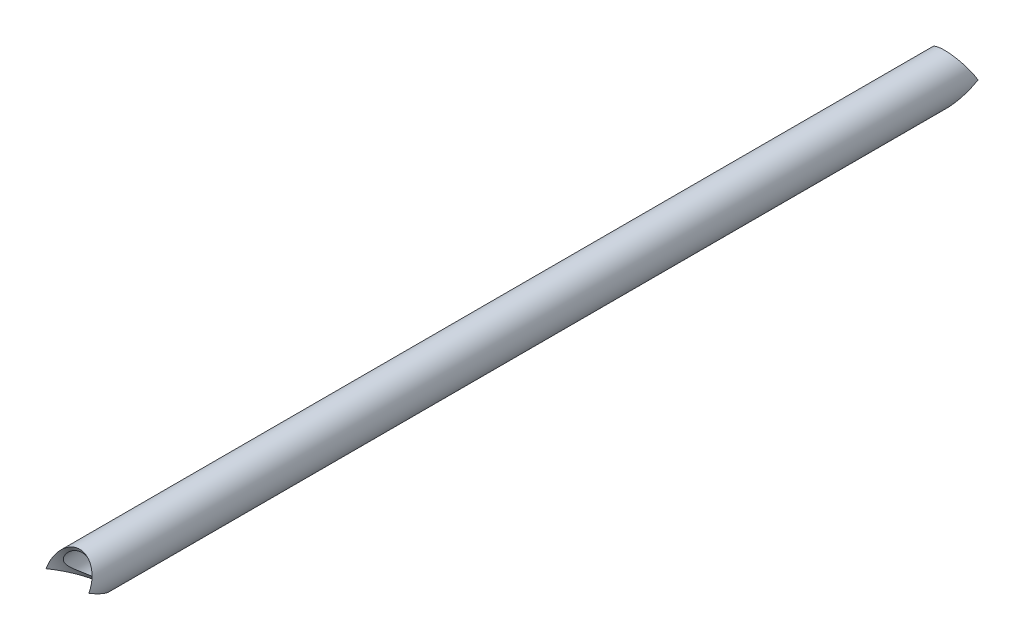
ISO-10303-21;
HEADER;
FILE_DESCRIPTION(('STEP AP214'),'2;1');
FILE_NAME('part.step','',(''),(''),'','','');
FILE_SCHEMA(('AUTOMOTIVE_DESIGN { 1 0 10303 214 1 1 1 1 }'));
ENDSEC;
DATA;
#1=APPLICATION_CONTEXT('core data for automotive mechanical design processes');
#2=APPLICATION_PROTOCOL_DEFINITION('international standard','automotive_design',2000,#1);
#3=PRODUCT_CONTEXT('',#1,'mechanical');
#4=PRODUCT('Part','Part','',(#3));
#5=PRODUCT_RELATED_PRODUCT_CATEGORY('part','',(#4));
#6=PRODUCT_DEFINITION_FORMATION('','',#4);
#7=PRODUCT_DEFINITION_CONTEXT('part definition',#1,'design');
#8=PRODUCT_DEFINITION('design','',#6,#7);
#9=PRODUCT_DEFINITION_SHAPE('','',#8);
#10=(LENGTH_UNIT() NAMED_UNIT(*) SI_UNIT(.MILLI.,.METRE.));
#11=(NAMED_UNIT(*) PLANE_ANGLE_UNIT() SI_UNIT($,.RADIAN.));
#12=(NAMED_UNIT(*) SI_UNIT($,.STERADIAN.) SOLID_ANGLE_UNIT());
#13=UNCERTAINTY_MEASURE_WITH_UNIT(LENGTH_MEASURE(1.E-05),#10,'distance_accuracy_value','');
#14=(GEOMETRIC_REPRESENTATION_CONTEXT(3) GLOBAL_UNCERTAINTY_ASSIGNED_CONTEXT((#13)) GLOBAL_UNIT_ASSIGNED_CONTEXT((#10,
#11,#12)) REPRESENTATION_CONTEXT('',''));
#15=CARTESIAN_POINT('',(0.,0.,0.));
#16=DIRECTION('',(0.,0.,1.));
#17=DIRECTION('',(1.,0.,0.));
#18=AXIS2_PLACEMENT_3D('',#15,#16,#17);
#19=CARTESIAN_POINT('',(2.62810606610486E-13,-6.0750000001009,-234.657183252118));
#20=DIRECTION('',(0.,0.,1.));
#21=DIRECTION('',(1.,0.,0.));
#22=AXIS2_PLACEMENT_3D('',#19,#20,#21);
#23=CYLINDRICAL_SURFACE('',#22,10.65);
#24=CARTESIAN_POINT('',(1.22685876863047E-13,-6.0750000001009,-221.492597114571));
#25=DIRECTION('',(0.,0.866025403784403,0.500000000000061));
#26=DIRECTION('',(0.,-0.500000000000061,0.866025403784403));
#27=AXIS2_PLACEMENT_3D('',#24,#25,#26);
#28=ELLIPSE('',#27,21.2999999999974,10.65);
#29=CARTESIAN_POINT('',(-10.6499999999999,-6.07500000010092,-221.492597114571));
#30=VERTEX_POINT('',#29);
#31=CARTESIAN_POINT('',(10.6500000000001,-6.07500000010088,-221.492597114571));
#32=VERTEX_POINT('',#31);
#33=EDGE_CURVE('E39',#30,#32,#28,.T.);
#34=ORIENTED_EDGE('',*,*,#33,.T.);
#35=CARTESIAN_POINT('',(1.22685876863047E-13,-6.0750000001009,-221.492597114571));
#36=DIRECTION('',(0.,-0.500000000000061,0.866025403784403));
#37=DIRECTION('',(0.,0.866025403784403,0.500000000000061));
#38=AXIS2_PLACEMENT_3D('',#35,#36,#37);
#39=ELLIPSE('',#38,12.2975607337395,10.65);
#40=EDGE_CURVE('E45',#32,#30,#39,.T.);
#41=ORIENTED_EDGE('',*,*,#40,.T.);
#42=EDGE_LOOP('',(#34,#41));
#43=FACE_BOUND('',#42,.T.);
#44=CARTESIAN_POINT('',(1.22685876863047E-13,-6.0750000001009,221.492597114571));
#45=DIRECTION('',(0.,-0.866025403784403,0.500000000000061));
#46=DIRECTION('',(0.,-0.500000000000061,-0.866025403784403));
#47=AXIS2_PLACEMENT_3D('',#44,#45,#46);
#48=ELLIPSE('',#47,21.2999999999974,10.65);
#49=CARTESIAN_POINT('',(-10.6499999999999,-6.07500000010092,221.492597114571));
#50=VERTEX_POINT('',#49);
#51=CARTESIAN_POINT('',(10.6500000000001,-6.07500000010088,221.492597114571));
#52=VERTEX_POINT('',#51);
#53=EDGE_CURVE('E64',#50,#52,#48,.T.);
#54=ORIENTED_EDGE('',*,*,#53,.F.);
#55=CARTESIAN_POINT('',(1.22685876863047E-13,-6.0750000001009,221.492597114571));
#56=DIRECTION('',(0.,0.500000000000061,0.866025403784403));
#57=DIRECTION('',(0.,0.866025403784403,-0.500000000000061));
#58=AXIS2_PLACEMENT_3D('',#55,#56,#57);
#59=ELLIPSE('',#58,12.2975607337395,10.65);
#60=EDGE_CURVE('E60',#52,#50,#59,.T.);
#61=ORIENTED_EDGE('',*,*,#60,.F.);
#62=EDGE_LOOP('',(#54,#61));
#63=FACE_BOUND('',#62,.T.);
#64=ADVANCED_FACE('F34',(#43,#63),#23,.T.);
#65=CARTESIAN_POINT('',(2.62810606610486E-13,-6.0750000001009,-234.657183252118));
#66=DIRECTION('',(0.,0.,1.));
#67=DIRECTION('',(1.,0.,0.));
#68=AXIS2_PLACEMENT_3D('',#65,#66,#67);
#69=CYLINDRICAL_SURFACE('',#68,8.65);
#70=CARTESIAN_POINT('',(8.65000000000026,-6.0750000001009,-214.31856988667));
#71=CARTESIAN_POINT('',(8.64999937803353,-5.92818391814189,-214.403334178954));
#72=CARTESIAN_POINT('',(8.64626274910733,-5.77875572488741,-214.483586237544));
#73=CARTESIAN_POINT('',(8.63051404007033,-5.47515065155016,-214.633652050164));
#74=CARTESIAN_POINT('',(8.61850310980531,-5.3209744341244,-214.703467252921));
#75=CARTESIAN_POINT('',(8.58549136002935,-5.00897766827809,-214.831379325089));
#76=CARTESIAN_POINT('',(8.56450206368782,-4.85116203560619,-214.889491075017));
#77=CARTESIAN_POINT('',(8.51297710355449,-4.53302790295168,-214.993351374035));
#78=CARTESIAN_POINT('',(8.48244146927621,-4.37270941070839,-215.039099961345));
#79=CARTESIAN_POINT('',(8.41148621827944,-4.05100459517885,-215.118138188344));
#80=CARTESIAN_POINT('',(8.37105601253816,-3.88961730931378,-215.151414383037));
#81=CARTESIAN_POINT('',(8.2803069748772,-3.56761051846948,-215.205960390574));
#82=CARTESIAN_POINT('',(8.22998781020915,-3.40699103951212,-215.227229799315));
#83=CARTESIAN_POINT('',(8.11955918288864,-3.08771822973509,-215.258856011481));
#84=CARTESIAN_POINT('',(8.05943008935736,-2.9290695422446,-215.269190616049));
#85=CARTESIAN_POINT('',(7.92980127101989,-2.61529040452393,-215.28028017569));
#86=CARTESIAN_POINT('',(7.86029883349685,-2.4601609880373,-215.281032351496));
#87=CARTESIAN_POINT('',(7.69251740767339,-2.1134301510355,-215.273613080845));
#88=CARTESIAN_POINT('',(7.59151815094356,-1.92319572058121,-215.262996184864));
#89=CARTESIAN_POINT('',(7.37601667855903,-1.55138491515996,-215.231890874316));
#90=CARTESIAN_POINT('',(7.26151062378756,-1.3698110225237,-215.211399647979));
#91=CARTESIAN_POINT('',(7.01974442801463,-1.01618599872964,-215.163277190634));
#92=CARTESIAN_POINT('',(6.8924746440974,-0.844142222170902,-215.135640536044));
#93=CARTESIAN_POINT('',(6.62602035216129,-0.51047482809886,-215.07559516932));
#94=CARTESIAN_POINT('',(6.48683667995924,-0.348850481004587,-215.043186791829));
#95=CARTESIAN_POINT('',(6.19369921715739,-0.0328005911682971,-214.974752058142));
#96=CARTESIAN_POINT('',(6.03946719637247,0.12135174210956,-214.93865653827));
#97=CARTESIAN_POINT('',(5.71996280967953,0.417454581883274,-214.865325286771));
#98=CARTESIAN_POINT('',(5.55469039583154,0.559405035389594,-214.828089550193));
#99=CARTESIAN_POINT('',(5.21389860047934,0.830443229247959,-214.753988132868));
#100=CARTESIAN_POINT('',(5.03838164399966,0.959533994239528,-214.717122366944));
#101=CARTESIAN_POINT('',(4.67787691764155,1.20424676270569,-214.64502303159));
#102=CARTESIAN_POINT('',(4.49288897525192,1.31986852072057,-214.609789491911));
#103=CARTESIAN_POINT('',(4.08963935720766,1.5511505009423,-214.537620721229));
#104=CARTESIAN_POINT('',(3.87018262639265,1.66485316123166,-214.501061843012));
#105=CARTESIAN_POINT('',(3.42170434916144,1.87330748079689,-214.432725766793));
#106=CARTESIAN_POINT('',(3.19268197861163,1.96805750310843,-214.400948981884));
#107=CARTESIAN_POINT('',(2.72667233822101,2.13774898214253,-214.343247801543));
#108=CARTESIAN_POINT('',(2.48968464132746,2.21268937487671,-214.317323720474));
#109=CARTESIAN_POINT('',(2.00954587057573,2.34200831155892,-214.272173457625));
#110=CARTESIAN_POINT('',(1.76639521489029,2.39638824662322,-214.252946822704));
#111=CARTESIAN_POINT('',(1.28688815577995,2.48204637620698,-214.222498941825));
#112=CARTESIAN_POINT('',(1.05071773862573,2.51425324174458,-214.210956658852));
#113=CARTESIAN_POINT('',(0.576287751522237,2.55906969920783,-214.194863836511));
#114=CARTESIAN_POINT('',(0.338028232849151,2.57167977078267,-214.190313126017));
#115=CARTESIAN_POINT('',(-0.138694398065788,2.57717181009427,-214.188333291338));
#116=CARTESIAN_POINT('',(-0.377157454410202,2.5700580902037,-214.190902610443));
#117=CARTESIAN_POINT('',(-0.852499060908479,2.53618555803724,-214.203086504878));
#118=CARTESIAN_POINT('',(-1.08937763949964,2.50942709929363,-214.212700953422));
#119=CARTESIAN_POINT('',(-1.55084699910016,2.43792048400041,-214.238206932494));
#120=CARTESIAN_POINT('',(-1.77556361879941,2.39389120626498,-214.253847229692));
#121=CARTESIAN_POINT('',(-2.22033596035138,2.28830373517407,-214.29097599264));
#122=CARTESIAN_POINT('',(-2.44039182888922,2.22674609436203,-214.312464274044));
#123=CARTESIAN_POINT('',(-2.87439182216442,2.08663978894635,-214.360703455727));
#124=CARTESIAN_POINT('',(-3.08833678882559,2.00809347784844,-214.38745362701));
#125=CARTESIAN_POINT('',(-3.50884695015058,1.83462882662579,-214.445473252315));
#126=CARTESIAN_POINT('',(-3.71541192514914,1.73970999966283,-214.476742840717));
#127=CARTESIAN_POINT('',(-4.12561504865931,1.53132550270658,-214.543811828955));
#128=CARTESIAN_POINT('',(-4.32901148650136,1.41741694075003,-214.579713127185));
#129=CARTESIAN_POINT('',(-4.72560996425205,1.17381198963311,-214.654143512758));
#130=CARTESIAN_POINT('',(-4.91881176220194,1.04411522599822,-214.69267266242));
#131=CARTESIAN_POINT('',(-5.29426000335263,0.769522023130603,-214.771006624231));
#132=CARTESIAN_POINT('',(-5.47649012979106,0.62460378450132,-214.810813207639));
#133=CARTESIAN_POINT('',(-5.82873985001123,0.320501220755215,-214.889963151437));
#134=CARTESIAN_POINT('',(-5.99875927649479,0.161316700243936,-214.929306505474));
#135=CARTESIAN_POINT('',(-6.33518765877032,-0.180202328669105,-215.007728087674));
#136=CARTESIAN_POINT('',(-6.50081325634424,-0.363344440878967,-215.046658172388));
#137=CARTESIAN_POINT('',(-6.81634213928543,-0.743858261151386,-215.118842657242));
#138=CARTESIAN_POINT('',(-6.96624167784306,-0.941233341472005,-215.152095705978));
#139=CARTESIAN_POINT('',(-7.24880778217018,-1.34862623761404,-215.209289924044));
#140=CARTESIAN_POINT('',(-7.38151120832252,-1.55861555028828,-215.23325123794));
#141=CARTESIAN_POINT('',(-7.62872444595299,-1.99005747432089,-215.267694096271));
#142=CARTESIAN_POINT('',(-7.74324661530751,-2.21150216250115,-215.278184831389));
#143=CARTESIAN_POINT('',(-7.91587661528786,-2.58394120092184,-215.280441159871));
#144=CARTESIAN_POINT('',(-7.97965328460128,-2.73229882181032,-215.277497809446));
#145=CARTESIAN_POINT('',(-8.09865941914403,-3.03194667188313,-215.262646050997));
#146=CARTESIAN_POINT('',(-8.15389168150594,-3.18323592302901,-215.250740584367));
#147=CARTESIAN_POINT('',(-8.2554380969152,-3.48735751122945,-215.216838493549));
#148=CARTESIAN_POINT('',(-8.30176915263766,-3.64018633186807,-215.194861269075));
#149=CARTESIAN_POINT('',(-8.38549388456894,-3.94634433815316,-215.139973232866));
#150=CARTESIAN_POINT('',(-8.42288752849253,-4.09967352560512,-215.107062381635));
#151=CARTESIAN_POINT('',(-8.48887463244796,-4.40583737007928,-215.029807214933));
#152=CARTESIAN_POINT('',(-8.51744234753745,-4.55866931727322,-214.985430131507));
#153=CARTESIAN_POINT('',(-8.56590540255666,-4.86200299054528,-214.885444391442));
#154=CARTESIAN_POINT('',(-8.58580081854713,-5.01250473704935,-214.829835833315));
#155=CARTESIAN_POINT('',(-8.61742448664831,-5.31019147266027,-214.707983310788));
#156=CARTESIAN_POINT('',(-8.62914387610751,-5.45737269573571,-214.641727900794));
#157=CARTESIAN_POINT('',(-8.64501885033591,-5.74748069437717,-214.49964607783));
#158=CARTESIAN_POINT('',(-8.64917188259975,-5.89040601823013,-214.423816444224));
#159=CARTESIAN_POINT('',(-8.65091176420859,-6.23194986388134,-214.229417078581));
#160=CARTESIAN_POINT('',(-8.64490991978785,-6.42810720231548,-214.106484110163));
#161=CARTESIAN_POINT('',(-8.62080404537304,-6.81052557395368,-213.847173136496));
#162=CARTESIAN_POINT('',(-8.60269349220117,-6.99678121452092,-213.710787918058));
#163=CARTESIAN_POINT('',(-8.55591593176121,-7.36050738609285,-213.427353553806));
#164=CARTESIAN_POINT('',(-8.52721453919786,-7.537947141297,-213.280270939749));
#165=CARTESIAN_POINT('',(-8.46048539057305,-7.88436872195521,-212.978398129048));
#166=CARTESIAN_POINT('',(-8.42245385331511,-8.05334708477396,-212.82360482784));
#167=CARTESIAN_POINT('',(-8.33930780952916,-8.37840220814502,-212.513515071326));
#168=CARTESIAN_POINT('',(-8.29446233610328,-8.53471951610767,-212.358396995954));
#169=CARTESIAN_POINT('',(-8.19738755510028,-8.84107106251888,-212.044387173413));
#170=CARTESIAN_POINT('',(-8.14515935111408,-8.99110623570116,-211.885495993206));
#171=CARTESIAN_POINT('',(-8.03358147622612,-9.28574819858371,-211.564926333264));
#172=CARTESIAN_POINT('',(-7.97422521882721,-9.4303498030485,-211.403245395676));
#173=CARTESIAN_POINT('',(-7.84858289044796,-9.71455859815115,-211.078170374462));
#174=CARTESIAN_POINT('',(-7.78229605383321,-9.85416523469392,-210.914776103357));
#175=CARTESIAN_POINT('',(-7.64278789689178,-10.1288919668576,-210.586994767443));
#176=CARTESIAN_POINT('',(-7.5695623719188,-10.2640092742325,-210.422607157912));
#177=CARTESIAN_POINT('',(-7.41613086611562,-10.5300058911494,-210.093633218607));
#178=CARTESIAN_POINT('',(-7.33592422353112,-10.6608847973078,-209.929046871455));
#179=CARTESIAN_POINT('',(-7.16842967186115,-10.9185222938855,-209.600461195008));
#180=CARTESIAN_POINT('',(-7.08114669097958,-11.0452836671715,-209.436461538831));
#181=CARTESIAN_POINT('',(-6.89920629382361,-11.294894467887,-209.109578678765));
#182=CARTESIAN_POINT('',(-6.80454875726971,-11.4177438314654,-208.946695493132));
#183=CARTESIAN_POINT('',(-6.56519981119249,-11.7115247676413,-208.553064258996));
#184=CARTESIAN_POINT('',(-6.41648661666513,-11.8804340933449,-208.323229781856));
#185=CARTESIAN_POINT('',(-6.1021040141915,-12.2100386201845,-207.869221850383));
#186=CARTESIAN_POINT('',(-5.93643204735865,-12.3707325762129,-207.645049256745));
#187=CARTESIAN_POINT('',(-5.58706670598686,-12.6827156752362,-207.205430472806));
#188=CARTESIAN_POINT('',(-5.40341885193532,-12.8340270663073,-206.989964097213));
#189=CARTESIAN_POINT('',(-5.01605964050975,-13.1262758980244,-206.570368858222));
#190=CARTESIAN_POINT('',(-4.81235869354405,-13.2672186557522,-206.366234197238));
#191=CARTESIAN_POINT('',(-4.46395431537802,-13.4858360011132,-206.047478363284));
#192=CARTESIAN_POINT('',(-4.32596965085822,-13.5673265354651,-205.928130201261));
#193=CARTESIAN_POINT('',(-4.04104693269482,-13.7247682173392,-205.69669519149));
#194=CARTESIAN_POINT('',(-3.89410768994059,-13.8007186262133,-205.584609312224));
#195=CARTESIAN_POINT('',(-3.43953622820813,-14.018863431312,-205.261648690583));
#196=CARTESIAN_POINT('',(-3.11767000653595,-14.1516605291854,-205.063618487489));
#197=CARTESIAN_POINT('',(-2.51329904826401,-14.3564868218933,-204.756915503415));
#198=CARTESIAN_POINT('',(-2.23837288737308,-14.4354670465624,-204.638162606368));
#199=CARTESIAN_POINT('',(-1.81149183588547,-14.5344559441326,-204.489011136104));
#200=CARTESIAN_POINT('',(-1.66677696284453,-14.5642061119258,-204.44412244753));
#201=CARTESIAN_POINT('',(-1.37323763265812,-14.6165986634819,-204.365001384351));
#202=CARTESIAN_POINT('',(-1.22441515227414,-14.6392444034896,-204.330763977974));
#203=CARTESIAN_POINT('',(-0.922228530534799,-14.6770575527531,-204.273563421091));
#204=CARTESIAN_POINT('',(-0.768835207762689,-14.6921542688322,-204.250706855103));
#205=CARTESIAN_POINT('',(-0.460111209939084,-14.7141399657246,-204.21741182182));
#206=CARTESIAN_POINT('',(-0.304780550296689,-14.7210290117776,-204.206973255819));
#207=CARTESIAN_POINT('',(0.00631804623118596,-14.7263962344597,-204.198841069384));
#208=CARTESIAN_POINT('',(0.162085851106803,-14.7248767237457,-204.201143944593));
#209=CARTESIAN_POINT('',(0.472597570432842,-14.713477071849,-204.218414303227));
#210=CARTESIAN_POINT('',(0.627341552834372,-14.7035974912497,-204.233380937485));
#211=CARTESIAN_POINT('',(0.914629127249093,-14.6775579324822,-204.272802058024));
#212=CARTESIAN_POINT('',(1.04746675019267,-14.6623698977834,-204.295787533905));
#213=CARTESIAN_POINT('',(1.31053948151359,-14.6261774919321,-204.350517530461));
#214=CARTESIAN_POINT('',(1.44077378597053,-14.605171352979,-204.382264713325));
#215=CARTESIAN_POINT('',(1.82650942834324,-14.5339970079904,-204.489725935052));
#216=CARTESIAN_POINT('',(2.07716005820117,-14.4756618015444,-204.577676472903));
#217=CARTESIAN_POINT('',(2.67701044964133,-14.3087067370691,-204.828621913453));
#218=CARTESIAN_POINT('',(3.0165714377184,-14.1893597727858,-205.007425315256));
#219=CARTESIAN_POINT('',(3.49694388024323,-13.9885470087134,-205.306335038703));
#220=CARTESIAN_POINT('',(3.65245291749707,-13.9178539233222,-205.411271039483));
#221=CARTESIAN_POINT('',(3.95415605806211,-13.7701478761526,-205.629750323816));
#222=CARTESIAN_POINT('',(4.10035178316889,-13.6931360200818,-205.7432921012));
#223=CARTESIAN_POINT('',(4.47217067277728,-13.4839136252541,-206.050518748322));
#224=CARTESIAN_POINT('',(4.69046621582095,-13.3472318744137,-206.2500232324));
#225=CARTESIAN_POINT('',(5.10542040241989,-13.0621722295382,-206.662762551199));
#226=CARTESIAN_POINT('',(5.30206445824718,-12.9137865641119,-206.876006491407));
#227=CARTESIAN_POINT('',(5.6761968927374,-12.6066202489088,-207.313164661516));
#228=CARTESIAN_POINT('',(5.8536163377944,-12.4478052715922,-207.537113392498));
#229=CARTESIAN_POINT('',(6.19021131259998,-12.1213821227297,-207.992028289499));
#230=CARTESIAN_POINT('',(6.34939068740933,-11.9537758153222,-208.2229929635));
#231=CARTESIAN_POINT('',(6.61712450602722,-11.6488278055271,-208.637261515534));
#232=CARTESIAN_POINT('',(6.72902472853557,-11.5131322709547,-208.819633069891));
#233=CARTESIAN_POINT('',(6.94326792392722,-11.2367929000729,-209.186267210885));
#234=CARTESIAN_POINT('',(7.04560988610095,-11.0961485426251,-209.370529995222));
#235=CARTESIAN_POINT('',(7.24122557898484,-10.809687271262,-209.740187930338));
#236=CARTESIAN_POINT('',(7.33449006193058,-10.6638652847315,-209.925584035565));
#237=CARTESIAN_POINT('',(7.51210861764674,-10.366929029481,-210.296389482724));
#238=CARTESIAN_POINT('',(7.59646314201677,-10.2158150295032,-210.481798823508));
#239=CARTESIAN_POINT('',(7.75620337110392,-9.90824485952115,-210.851182525652));
#240=CARTESIAN_POINT('',(7.83161100983176,-9.75180301735941,-211.035159317978));
#241=CARTESIAN_POINT('',(7.97368173187773,-9.43259257532649,-211.401043609676));
#242=CARTESIAN_POINT('',(8.04034383363427,-9.26982326794085,-211.582950874684));
#243=CARTESIAN_POINT('',(8.16459670931731,-8.93739573476339,-211.943072125657));
#244=CARTESIAN_POINT('',(8.22219981237286,-8.76774727418428,-212.121290839527));
#245=CARTESIAN_POINT('',(8.32794134031502,-8.42039006356103,-212.472548478145));
#246=CARTESIAN_POINT('',(8.37608284212251,-8.2426839570839,-212.645589071252));
#247=CARTESIAN_POINT('',(8.4547282351649,-7.90916947852937,-212.955362493601));
#248=CARTESIAN_POINT('',(8.48684042867025,-7.75481212066091,-213.093244527845));
#249=CARTESIAN_POINT('',(8.54328935211217,-7.43898150883778,-213.362357764532));
#250=CARTESIAN_POINT('',(8.56762596647533,-7.277508149154,-213.493588868094));
#251=CARTESIAN_POINT('',(8.60751619567153,-6.94721879375606,-213.747078112623));
#252=CARTESIAN_POINT('',(8.62309164938072,-6.77842219534786,-213.86935789795));
#253=CARTESIAN_POINT('',(8.64433263886607,-6.4327368227116,-214.102895405708));
#254=CARTESIAN_POINT('',(8.6500007661479,-6.25585017706147,-214.214156003294));
#255=CARTESIAN_POINT('',(8.65000000000026,-6.0750000001009,-214.31856988667));
#256=B_SPLINE_CURVE_WITH_KNOTS('',3,(#70,#71,#72,#73,#74,#75,#76,#77,#78,#79,#80,#81,#82,#83,
#84,#85,#86,#87,#88,#89,#90,#91,#92,#93,#94,#95,#96,#97,#98,#99,#100,#101,#102,#103,#104,#105,
#106,#107,#108,#109,#110,#111,#112,#113,#114,#115,#116,#117,#118,#119,#120,#121,#122,#123,#124,
#125,#126,#127,#128,#129,#130,#131,#132,#133,#134,#135,#136,#137,#138,#139,#140,#141,#142,#143,
#144,#145,#146,#147,#148,#149,#150,#151,#152,#153,#154,#155,#156,#157,#158,#159,#160,#161,#162,
#163,#164,#165,#166,#167,#168,#169,#170,#171,#172,#173,#174,#175,#176,#177,#178,#179,#180,#181,
#182,#183,#184,#185,#186,#187,#188,#189,#190,#191,#192,#193,#194,#195,#196,#197,#198,#199,#200,
#201,#202,#203,#204,#205,#206,#207,#208,#209,#210,#211,#212,#213,#214,#215,#216,#217,#218,#219,
#220,#221,#222,#223,#224,#225,#226,#227,#228,#229,#230,#231,#232,#233,#234,#235,#236,#237,#238,
#239,#240,#241,#242,#243,#244,#245,#246,#247,#248,#249,#250,#251,#252,#253,#254,#255),
.UNSPECIFIED.,.T.,.F.,(4,2,2,2,2,2,2,2,2,2,2,2,2,2,2,2,2,2,2,2,2,2,2,2,2,2,2,2,2,2,2,2,2,2,2,2,
2,2,2,2,2,2,2,2,2,2,2,2,2,2,2,2,2,2,2,2,2,2,2,2,2,2,2,2,2,2,2,2,2,2,2,2,2,2,2,2,2,2,2,2,2,2,2,2,
2,2,2,2,2,2,2,2,4),(0.,0.50844506770032,1.01681949312021,1.52454340032979,2.03226573787238,
2.54053382673734,3.04881902097642,3.55813412185321,4.06759693996536,4.71359002947254,
5.35976717786682,6.00643624012418,6.6530599725448,7.31551844685078,7.9779797978934,
8.6402849662055,9.30260220250564,10.0512091879152,10.7998808036044,11.5485926227777,
12.2972537751969,13.0122575701417,13.7272438644488,14.4420738478247,15.1568909672331,
15.8446653307737,16.5324180161265,17.2200754854148,17.9077534057857,18.6145823037831,
19.3214279700606,20.0293001149051,20.7371819564203,21.4861817527539,22.2353595985674,
22.982904015949,23.7299381285009,24.2140392664683,24.6979815901783,25.180995661056,
25.6640114767329,26.1484232132305,26.6328307010897,27.117762464654,27.6028577893435,
28.2964167818695,28.9903497083936,29.686555740942,30.3830443900298,31.0569944659831,
31.7308439043488,32.4053208577864,33.0798724008734,33.7548353491971,34.4298623484516,
35.1044232089343,35.7789950738536,36.7434305731184,37.708011809881,38.6702106916392,
39.6319126633935,40.2309613246267,40.8300897097657,42.0261773485565,42.9515592316291,
43.4142860297685,43.8767938980604,44.3435554209343,44.8103132336663,45.2769426775158,
45.7435408340745,46.1500870679645,46.5567569645805,47.3697458590115,48.5683011522664,
49.1693990091058,49.7703919045981,50.7462014804333,51.7226645377541,52.7025204724633,
53.6821694691644,54.4420360299657,55.2019828498199,55.9626959419759,56.7233704590089,
57.4821398028627,58.2409942350116,58.9988067717562,59.7563724579484,60.3844095628076,
61.0124560021506,61.6389298975941,62.2652398987969),.UNSPECIFIED.);
#257=CARTESIAN_POINT('',(8.65000000000026,-6.0750000001009,-214.31856988667));
#258=VERTEX_POINT('',#257);
#259=EDGE_CURVE('E11',#258,#258,#256,.T.);
#260=ORIENTED_EDGE('',*,*,#259,.F.);
#261=EDGE_LOOP('',(#260));
#262=FACE_BOUND('',#261,.T.);
#263=CARTESIAN_POINT('',(8.65000000000026,-6.0750000001009,214.31856988667));
#264=CARTESIAN_POINT('',(8.64999937803353,-5.92818391814189,214.403334178954));
#265=CARTESIAN_POINT('',(8.64626274910733,-5.77875572488741,214.483586237544));
#266=CARTESIAN_POINT('',(8.63051404007033,-5.47515065155016,214.633652050164));
#267=CARTESIAN_POINT('',(8.61850310980531,-5.3209744341244,214.703467252921));
#268=CARTESIAN_POINT('',(8.58549136002935,-5.00897766827809,214.831379325089));
#269=CARTESIAN_POINT('',(8.56450206368782,-4.85116203560619,214.889491075017));
#270=CARTESIAN_POINT('',(8.51297710355449,-4.53302790295168,214.993351374035));
#271=CARTESIAN_POINT('',(8.48244146927621,-4.37270941070839,215.039099961345));
#272=CARTESIAN_POINT('',(8.41148621827944,-4.05100459517885,215.118138188344));
#273=CARTESIAN_POINT('',(8.37105601253816,-3.88961730931378,215.151414383037));
#274=CARTESIAN_POINT('',(8.2803069748772,-3.56761051846948,215.205960390574));
#275=CARTESIAN_POINT('',(8.22998781020915,-3.40699103951212,215.227229799315));
#276=CARTESIAN_POINT('',(8.11955918288864,-3.08771822973509,215.258856011481));
#277=CARTESIAN_POINT('',(8.05943008935736,-2.9290695422446,215.269190616049));
#278=CARTESIAN_POINT('',(7.92980127101989,-2.61529040452393,215.28028017569));
#279=CARTESIAN_POINT('',(7.86029883349685,-2.4601609880373,215.281032351496));
#280=CARTESIAN_POINT('',(7.69251740767339,-2.1134301510355,215.273613080845));
#281=CARTESIAN_POINT('',(7.59151815094356,-1.92319572058121,215.262996184864));
#282=CARTESIAN_POINT('',(7.37601667855903,-1.55138491515996,215.231890874316));
#283=CARTESIAN_POINT('',(7.26151062378756,-1.3698110225237,215.211399647979));
#284=CARTESIAN_POINT('',(7.01974442801463,-1.01618599872964,215.163277190634));
#285=CARTESIAN_POINT('',(6.8924746440974,-0.844142222170902,215.135640536044));
#286=CARTESIAN_POINT('',(6.62602035216129,-0.51047482809886,215.07559516932));
#287=CARTESIAN_POINT('',(6.48683667995924,-0.348850481004587,215.043186791829));
#288=CARTESIAN_POINT('',(6.19369921715739,-0.0328005911682971,214.974752058142));
#289=CARTESIAN_POINT('',(6.03946719637247,0.12135174210956,214.93865653827));
#290=CARTESIAN_POINT('',(5.71996280967953,0.417454581883274,214.865325286771));
#291=CARTESIAN_POINT('',(5.55469039583154,0.559405035389594,214.828089550193));
#292=CARTESIAN_POINT('',(5.21389860047934,0.830443229247959,214.753988132868));
#293=CARTESIAN_POINT('',(5.03838164399966,0.959533994239528,214.717122366944));
#294=CARTESIAN_POINT('',(4.67787691764155,1.20424676270569,214.64502303159));
#295=CARTESIAN_POINT('',(4.49288897525192,1.31986852072057,214.609789491911));
#296=CARTESIAN_POINT('',(4.08963935720766,1.5511505009423,214.537620721229));
#297=CARTESIAN_POINT('',(3.87018262639265,1.66485316123166,214.501061843012));
#298=CARTESIAN_POINT('',(3.42170434916144,1.87330748079689,214.432725766793));
#299=CARTESIAN_POINT('',(3.19268197861163,1.96805750310843,214.400948981884));
#300=CARTESIAN_POINT('',(2.72667233822101,2.13774898214253,214.343247801543));
#301=CARTESIAN_POINT('',(2.48968464132746,2.21268937487671,214.317323720474));
#302=CARTESIAN_POINT('',(2.00954587057573,2.34200831155892,214.272173457625));
#303=CARTESIAN_POINT('',(1.76639521489029,2.39638824662322,214.252946822704));
#304=CARTESIAN_POINT('',(1.28688815577995,2.48204637620698,214.222498941825));
#305=CARTESIAN_POINT('',(1.05071773862573,2.51425324174458,214.210956658852));
#306=CARTESIAN_POINT('',(0.576287751522237,2.55906969920783,214.194863836511));
#307=CARTESIAN_POINT('',(0.338028232849151,2.57167977078267,214.190313126017));
#308=CARTESIAN_POINT('',(-0.138694398065788,2.57717181009427,214.188333291338));
#309=CARTESIAN_POINT('',(-0.377157454410202,2.5700580902037,214.190902610443));
#310=CARTESIAN_POINT('',(-0.852499060908479,2.53618555803724,214.203086504878));
#311=CARTESIAN_POINT('',(-1.08937763949964,2.50942709929363,214.212700953422));
#312=CARTESIAN_POINT('',(-1.55084699910016,2.43792048400041,214.238206932494));
#313=CARTESIAN_POINT('',(-1.77556361879941,2.39389120626498,214.253847229692));
#314=CARTESIAN_POINT('',(-2.22033596035138,2.28830373517407,214.29097599264));
#315=CARTESIAN_POINT('',(-2.44039182888922,2.22674609436203,214.312464274044));
#316=CARTESIAN_POINT('',(-2.87439182216442,2.08663978894635,214.360703455727));
#317=CARTESIAN_POINT('',(-3.08833678882559,2.00809347784844,214.38745362701));
#318=CARTESIAN_POINT('',(-3.50884695015058,1.83462882662579,214.445473252315));
#319=CARTESIAN_POINT('',(-3.71541192514914,1.73970999966283,214.476742840717));
#320=CARTESIAN_POINT('',(-4.12561504865931,1.53132550270658,214.543811828955));
#321=CARTESIAN_POINT('',(-4.32901148650136,1.41741694075003,214.579713127185));
#322=CARTESIAN_POINT('',(-4.72560996425205,1.17381198963311,214.654143512758));
#323=CARTESIAN_POINT('',(-4.91881176220194,1.04411522599822,214.69267266242));
#324=CARTESIAN_POINT('',(-5.29426000335263,0.769522023130603,214.771006624231));
#325=CARTESIAN_POINT('',(-5.47649012979106,0.62460378450132,214.810813207639));
#326=CARTESIAN_POINT('',(-5.82873985001123,0.320501220755215,214.889963151437));
#327=CARTESIAN_POINT('',(-5.99875927649479,0.161316700243936,214.929306505474));
#328=CARTESIAN_POINT('',(-6.33518765877032,-0.180202328669105,215.007728087674));
#329=CARTESIAN_POINT('',(-6.50081325634424,-0.363344440878967,215.046658172388));
#330=CARTESIAN_POINT('',(-6.81634213928543,-0.743858261151386,215.118842657242));
#331=CARTESIAN_POINT('',(-6.96624167784306,-0.941233341472005,215.152095705978));
#332=CARTESIAN_POINT('',(-7.24880778217018,-1.34862623761404,215.209289924044));
#333=CARTESIAN_POINT('',(-7.38151120832252,-1.55861555028828,215.23325123794));
#334=CARTESIAN_POINT('',(-7.62872444595299,-1.99005747432089,215.267694096271));
#335=CARTESIAN_POINT('',(-7.74324661530751,-2.21150216250115,215.278184831389));
#336=CARTESIAN_POINT('',(-7.91587661528786,-2.58394120092184,215.280441159871));
#337=CARTESIAN_POINT('',(-7.97965328460128,-2.73229882181032,215.277497809446));
#338=CARTESIAN_POINT('',(-8.09865941914403,-3.03194667188313,215.262646050997));
#339=CARTESIAN_POINT('',(-8.15389168150594,-3.18323592302901,215.250740584367));
#340=CARTESIAN_POINT('',(-8.2554380969152,-3.48735751122945,215.216838493549));
#341=CARTESIAN_POINT('',(-8.30176915263766,-3.64018633186807,215.194861269075));
#342=CARTESIAN_POINT('',(-8.38549388456894,-3.94634433815316,215.139973232866));
#343=CARTESIAN_POINT('',(-8.42288752849253,-4.09967352560512,215.107062381635));
#344=CARTESIAN_POINT('',(-8.48887463244796,-4.40583737007928,215.029807214933));
#345=CARTESIAN_POINT('',(-8.51744234753745,-4.55866931727322,214.985430131507));
#346=CARTESIAN_POINT('',(-8.56590540255666,-4.86200299054528,214.885444391442));
#347=CARTESIAN_POINT('',(-8.58580081854713,-5.01250473704935,214.829835833315));
#348=CARTESIAN_POINT('',(-8.61742448664831,-5.31019147266027,214.707983310788));
#349=CARTESIAN_POINT('',(-8.62914387610751,-5.45737269573571,214.641727900794));
#350=CARTESIAN_POINT('',(-8.64501885033591,-5.74748069437717,214.49964607783));
#351=CARTESIAN_POINT('',(-8.64917188259975,-5.89040601823013,214.423816444224));
#352=CARTESIAN_POINT('',(-8.65091176420859,-6.23194986388134,214.229417078581));
#353=CARTESIAN_POINT('',(-8.64490991978785,-6.42810720231548,214.106484110163));
#354=CARTESIAN_POINT('',(-8.62080404537304,-6.81052557395368,213.847173136496));
#355=CARTESIAN_POINT('',(-8.60269349220117,-6.99678121452092,213.710787918058));
#356=CARTESIAN_POINT('',(-8.55591593176121,-7.36050738609285,213.427353553806));
#357=CARTESIAN_POINT('',(-8.52721453919786,-7.537947141297,213.280270939749));
#358=CARTESIAN_POINT('',(-8.46048539057305,-7.88436872195521,212.978398129048));
#359=CARTESIAN_POINT('',(-8.42245385331511,-8.05334708477396,212.82360482784));
#360=CARTESIAN_POINT('',(-8.33930780952916,-8.37840220814502,212.513515071326));
#361=CARTESIAN_POINT('',(-8.29446233610328,-8.53471951610767,212.358396995954));
#362=CARTESIAN_POINT('',(-8.19738755510028,-8.84107106251888,212.044387173413));
#363=CARTESIAN_POINT('',(-8.14515935111408,-8.99110623570116,211.885495993206));
#364=CARTESIAN_POINT('',(-8.03358147622612,-9.28574819858371,211.564926333264));
#365=CARTESIAN_POINT('',(-7.97422521882721,-9.4303498030485,211.403245395676));
#366=CARTESIAN_POINT('',(-7.84858289044796,-9.71455859815115,211.078170374462));
#367=CARTESIAN_POINT('',(-7.78229605383321,-9.85416523469392,210.914776103357));
#368=CARTESIAN_POINT('',(-7.64278789689178,-10.1288919668576,210.586994767443));
#369=CARTESIAN_POINT('',(-7.5695623719188,-10.2640092742325,210.422607157912));
#370=CARTESIAN_POINT('',(-7.41613086611562,-10.5300058911494,210.093633218607));
#371=CARTESIAN_POINT('',(-7.33592422353112,-10.6608847973078,209.929046871455));
#372=CARTESIAN_POINT('',(-7.16842967186115,-10.9185222938855,209.600461195008));
#373=CARTESIAN_POINT('',(-7.08114669097958,-11.0452836671715,209.436461538831));
#374=CARTESIAN_POINT('',(-6.89920629382361,-11.294894467887,209.109578678765));
#375=CARTESIAN_POINT('',(-6.80454875726971,-11.4177438314654,208.946695493132));
#376=CARTESIAN_POINT('',(-6.56519981119249,-11.7115247676413,208.553064258996));
#377=CARTESIAN_POINT('',(-6.41648661666513,-11.8804340933449,208.323229781856));
#378=CARTESIAN_POINT('',(-6.1021040141915,-12.2100386201845,207.869221850383));
#379=CARTESIAN_POINT('',(-5.93643204735865,-12.3707325762129,207.645049256745));
#380=CARTESIAN_POINT('',(-5.58706670598686,-12.6827156752362,207.205430472806));
#381=CARTESIAN_POINT('',(-5.40341885193532,-12.8340270663073,206.989964097213));
#382=CARTESIAN_POINT('',(-5.01605964050975,-13.1262758980244,206.570368858222));
#383=CARTESIAN_POINT('',(-4.81235869354405,-13.2672186557522,206.366234197238));
#384=CARTESIAN_POINT('',(-4.46395431537802,-13.4858360011132,206.047478363284));
#385=CARTESIAN_POINT('',(-4.32596965085822,-13.5673265354651,205.928130201261));
#386=CARTESIAN_POINT('',(-4.04104693269482,-13.7247682173392,205.69669519149));
#387=CARTESIAN_POINT('',(-3.89410768994059,-13.8007186262133,205.584609312224));
#388=CARTESIAN_POINT('',(-3.43953622820813,-14.018863431312,205.261648690583));
#389=CARTESIAN_POINT('',(-3.11767000653595,-14.1516605291854,205.063618487489));
#390=CARTESIAN_POINT('',(-2.51329904826401,-14.3564868218933,204.756915503415));
#391=CARTESIAN_POINT('',(-2.23837288737308,-14.4354670465624,204.638162606368));
#392=CARTESIAN_POINT('',(-1.81149183588547,-14.5344559441326,204.489011136104));
#393=CARTESIAN_POINT('',(-1.66677696284453,-14.5642061119258,204.44412244753));
#394=CARTESIAN_POINT('',(-1.37323763265812,-14.6165986634819,204.365001384351));
#395=CARTESIAN_POINT('',(-1.22441515227414,-14.6392444034896,204.330763977974));
#396=CARTESIAN_POINT('',(-0.922228530534799,-14.6770575527531,204.273563421091));
#397=CARTESIAN_POINT('',(-0.768835207762689,-14.6921542688322,204.250706855103));
#398=CARTESIAN_POINT('',(-0.460111209939084,-14.7141399657246,204.21741182182));
#399=CARTESIAN_POINT('',(-0.304780550296689,-14.7210290117776,204.206973255819));
#400=CARTESIAN_POINT('',(0.00631804623118596,-14.7263962344597,204.198841069384));
#401=CARTESIAN_POINT('',(0.162085851106803,-14.7248767237457,204.201143944593));
#402=CARTESIAN_POINT('',(0.472597570432842,-14.713477071849,204.218414303227));
#403=CARTESIAN_POINT('',(0.627341552834372,-14.7035974912497,204.233380937485));
#404=CARTESIAN_POINT('',(0.914629127249093,-14.6775579324822,204.272802058024));
#405=CARTESIAN_POINT('',(1.04746675019267,-14.6623698977834,204.295787533905));
#406=CARTESIAN_POINT('',(1.31053948151359,-14.6261774919321,204.350517530461));
#407=CARTESIAN_POINT('',(1.44077378597053,-14.605171352979,204.382264713325));
#408=CARTESIAN_POINT('',(1.82650942834324,-14.5339970079904,204.489725935052));
#409=CARTESIAN_POINT('',(2.07716005820117,-14.4756618015444,204.577676472903));
#410=CARTESIAN_POINT('',(2.67701044964133,-14.3087067370691,204.828621913453));
#411=CARTESIAN_POINT('',(3.0165714377184,-14.1893597727858,205.007425315256));
#412=CARTESIAN_POINT('',(3.49694388024323,-13.9885470087134,205.306335038703));
#413=CARTESIAN_POINT('',(3.65245291749707,-13.9178539233222,205.411271039483));
#414=CARTESIAN_POINT('',(3.95415605806211,-13.7701478761526,205.629750323816));
#415=CARTESIAN_POINT('',(4.10035178316889,-13.6931360200818,205.7432921012));
#416=CARTESIAN_POINT('',(4.47217067277728,-13.4839136252541,206.050518748322));
#417=CARTESIAN_POINT('',(4.69046621582095,-13.3472318744137,206.2500232324));
#418=CARTESIAN_POINT('',(5.10542040241989,-13.0621722295382,206.662762551199));
#419=CARTESIAN_POINT('',(5.30206445824718,-12.9137865641119,206.876006491407));
#420=CARTESIAN_POINT('',(5.6761968927374,-12.6066202489088,207.313164661516));
#421=CARTESIAN_POINT('',(5.8536163377944,-12.4478052715922,207.537113392498));
#422=CARTESIAN_POINT('',(6.19021131259998,-12.1213821227297,207.992028289499));
#423=CARTESIAN_POINT('',(6.34939068740933,-11.9537758153222,208.2229929635));
#424=CARTESIAN_POINT('',(6.61712450602722,-11.6488278055271,208.637261515534));
#425=CARTESIAN_POINT('',(6.72902472853557,-11.5131322709547,208.819633069891));
#426=CARTESIAN_POINT('',(6.94326792392722,-11.2367929000729,209.186267210885));
#427=CARTESIAN_POINT('',(7.04560988610095,-11.0961485426251,209.370529995222));
#428=CARTESIAN_POINT('',(7.24122557898484,-10.809687271262,209.740187930338));
#429=CARTESIAN_POINT('',(7.33449006193058,-10.6638652847315,209.925584035565));
#430=CARTESIAN_POINT('',(7.51210861764674,-10.366929029481,210.296389482724));
#431=CARTESIAN_POINT('',(7.59646314201677,-10.2158150295032,210.481798823508));
#432=CARTESIAN_POINT('',(7.75620337110392,-9.90824485952115,210.851182525652));
#433=CARTESIAN_POINT('',(7.83161100983176,-9.75180301735941,211.035159317978));
#434=CARTESIAN_POINT('',(7.97368173187773,-9.43259257532649,211.401043609676));
#435=CARTESIAN_POINT('',(8.04034383363427,-9.26982326794085,211.582950874684));
#436=CARTESIAN_POINT('',(8.16459670931731,-8.93739573476339,211.943072125657));
#437=CARTESIAN_POINT('',(8.22219981237286,-8.76774727418428,212.121290839527));
#438=CARTESIAN_POINT('',(8.32794134031502,-8.42039006356103,212.472548478145));
#439=CARTESIAN_POINT('',(8.37608284212251,-8.2426839570839,212.645589071252));
#440=CARTESIAN_POINT('',(8.4547282351649,-7.90916947852937,212.955362493601));
#441=CARTESIAN_POINT('',(8.48684042867025,-7.75481212066091,213.093244527845));
#442=CARTESIAN_POINT('',(8.54328935211217,-7.43898150883778,213.362357764532));
#443=CARTESIAN_POINT('',(8.56762596647533,-7.277508149154,213.493588868094));
#444=CARTESIAN_POINT('',(8.60751619567153,-6.94721879375606,213.747078112623));
#445=CARTESIAN_POINT('',(8.62309164938072,-6.77842219534786,213.86935789795));
#446=CARTESIAN_POINT('',(8.64433263886607,-6.4327368227116,214.102895405708));
#447=CARTESIAN_POINT('',(8.6500007661479,-6.25585017706147,214.214156003294));
#448=CARTESIAN_POINT('',(8.65000000000026,-6.0750000001009,214.31856988667));
#449=B_SPLINE_CURVE_WITH_KNOTS('',3,(#263,#264,#265,#266,#267,#268,#269,#270,#271,#272,#273,
#274,#275,#276,#277,#278,#279,#280,#281,#282,#283,#284,#285,#286,#287,#288,#289,#290,#291,#292,
#293,#294,#295,#296,#297,#298,#299,#300,#301,#302,#303,#304,#305,#306,#307,#308,#309,#310,#311,
#312,#313,#314,#315,#316,#317,#318,#319,#320,#321,#322,#323,#324,#325,#326,#327,#328,#329,#330,
#331,#332,#333,#334,#335,#336,#337,#338,#339,#340,#341,#342,#343,#344,#345,#346,#347,#348,#349,
#350,#351,#352,#353,#354,#355,#356,#357,#358,#359,#360,#361,#362,#363,#364,#365,#366,#367,#368,
#369,#370,#371,#372,#373,#374,#375,#376,#377,#378,#379,#380,#381,#382,#383,#384,#385,#386,#387,
#388,#389,#390,#391,#392,#393,#394,#395,#396,#397,#398,#399,#400,#401,#402,#403,#404,#405,#406,
#407,#408,#409,#410,#411,#412,#413,#414,#415,#416,#417,#418,#419,#420,#421,#422,#423,#424,#425,
#426,#427,#428,#429,#430,#431,#432,#433,#434,#435,#436,#437,#438,#439,#440,#441,#442,#443,#444,
#445,#446,#447,#448),.UNSPECIFIED.,.T.,.F.,(4,2,2,2,2,2,2,2,2,2,2,2,2,2,2,2,2,2,2,2,2,2,2,2,2,2,
2,2,2,2,2,2,2,2,2,2,2,2,2,2,2,2,2,2,2,2,2,2,2,2,2,2,2,2,2,2,2,2,2,2,2,2,2,2,2,2,2,2,2,2,2,2,2,2,
2,2,2,2,2,2,2,2,2,2,2,2,2,2,2,2,2,2,4),(0.,0.50844506770032,1.01681949312021,1.52454340032979,
2.03226573787238,2.54053382673734,3.04881902097642,3.55813412185321,4.06759693996536,
4.71359002947254,5.35976717786682,6.00643624012418,6.6530599725448,7.31551844685078,
7.9779797978934,8.6402849662055,9.30260220250564,10.0512091879152,10.7998808036044,
11.5485926227777,12.2972537751969,13.0122575701417,13.7272438644488,14.4420738478247,
15.1568909672331,15.8446653307737,16.5324180161265,17.2200754854148,17.9077534057857,
18.6145823037831,19.3214279700606,20.0293001149051,20.7371819564203,21.4861817527539,
22.2353595985674,22.982904015949,23.7299381285009,24.2140392664683,24.6979815901783,
25.180995661056,25.6640114767329,26.1484232132305,26.6328307010897,27.117762464654,
27.6028577893435,28.2964167818695,28.9903497083936,29.686555740942,30.3830443900298,
31.0569944659831,31.7308439043488,32.4053208577864,33.0798724008734,33.7548353491971,
34.4298623484516,35.1044232089343,35.7789950738536,36.7434305731184,37.708011809881,
38.6702106916392,39.6319126633935,40.2309613246267,40.8300897097657,42.0261773485565,
42.9515592316291,43.4142860297685,43.8767938980604,44.3435554209343,44.8103132336663,
45.2769426775158,45.7435408340745,46.1500870679645,46.5567569645805,47.3697458590115,
48.5683011522664,49.1693990091058,49.7703919045981,50.7462014804333,51.7226645377541,
52.7025204724633,53.6821694691644,54.4420360299657,55.2019828498199,55.9626959419759,
56.7233704590089,57.4821398028627,58.2409942350116,58.9988067717562,59.7563724579484,
60.3844095628076,61.0124560021506,61.6389298975941,62.2652398987969),.UNSPECIFIED.);
#450=CARTESIAN_POINT('',(8.65000000000026,-6.0750000001009,214.31856988667));
#451=VERTEX_POINT('',#450);
#452=EDGE_CURVE('E66',#451,#451,#449,.T.);
#453=ORIENTED_EDGE('',*,*,#452,.T.);
#454=EDGE_LOOP('',(#453));
#455=FACE_BOUND('',#454,.T.);
#456=ADVANCED_FACE('F73',(#262,#455),#69,.F.);
#457=CARTESIAN_POINT('',(0.,0.749999999940881,-225.433012701813));
#458=DIRECTION('',(0.,-0.866025403784509,0.499999999999877));
#459=DIRECTION('',(-1.27906787077986E-10,-0.499999999999877,-0.866025403784509));
#460=AXIS2_PLACEMENT_3D('',#457,#458,#459);
#461=CYLINDRICAL_SURFACE('',#460,10.65);
#462=ORIENTED_EDGE('',*,*,#40,.F.);
#463=ORIENTED_EDGE('',*,*,#33,.F.);
#464=EDGE_LOOP('',(#462,#463));
#465=FACE_BOUND('',#464,.T.);
#466=ORIENTED_EDGE('',*,*,#259,.T.);
#467=EDGE_LOOP('',(#466));
#468=FACE_BOUND('',#467,.T.);
#469=ADVANCED_FACE('F36',(#465,#468),#461,.F.);
#470=CARTESIAN_POINT('',(0.,0.749999999940881,225.433012701813));
#471=DIRECTION('',(0.,-0.866025403784509,-0.499999999999877));
#472=DIRECTION('',(-1.27906787077986E-10,-0.499999999999877,0.866025403784509));
#473=AXIS2_PLACEMENT_3D('',#470,#471,#472);
#474=CYLINDRICAL_SURFACE('',#473,10.65);
#475=ORIENTED_EDGE('',*,*,#60,.T.);
#476=ORIENTED_EDGE('',*,*,#53,.T.);
#477=EDGE_LOOP('',(#475,#476));
#478=FACE_BOUND('',#477,.T.);
#479=ORIENTED_EDGE('',*,*,#452,.F.);
#480=EDGE_LOOP('',(#479));
#481=FACE_BOUND('',#480,.T.);
#482=ADVANCED_FACE('F62',(#478,#481),#474,.F.);
#483=CLOSED_SHELL('',(#64,#456,#469,#482));
#484=MANIFOLD_SOLID_BREP('B2',#483);
#485=ADVANCED_BREP_SHAPE_REPRESENTATION('',(#18,#484),#14);
#486=SHAPE_DEFINITION_REPRESENTATION(#9,#485);
ENDSEC;
END-ISO-10303-21;
